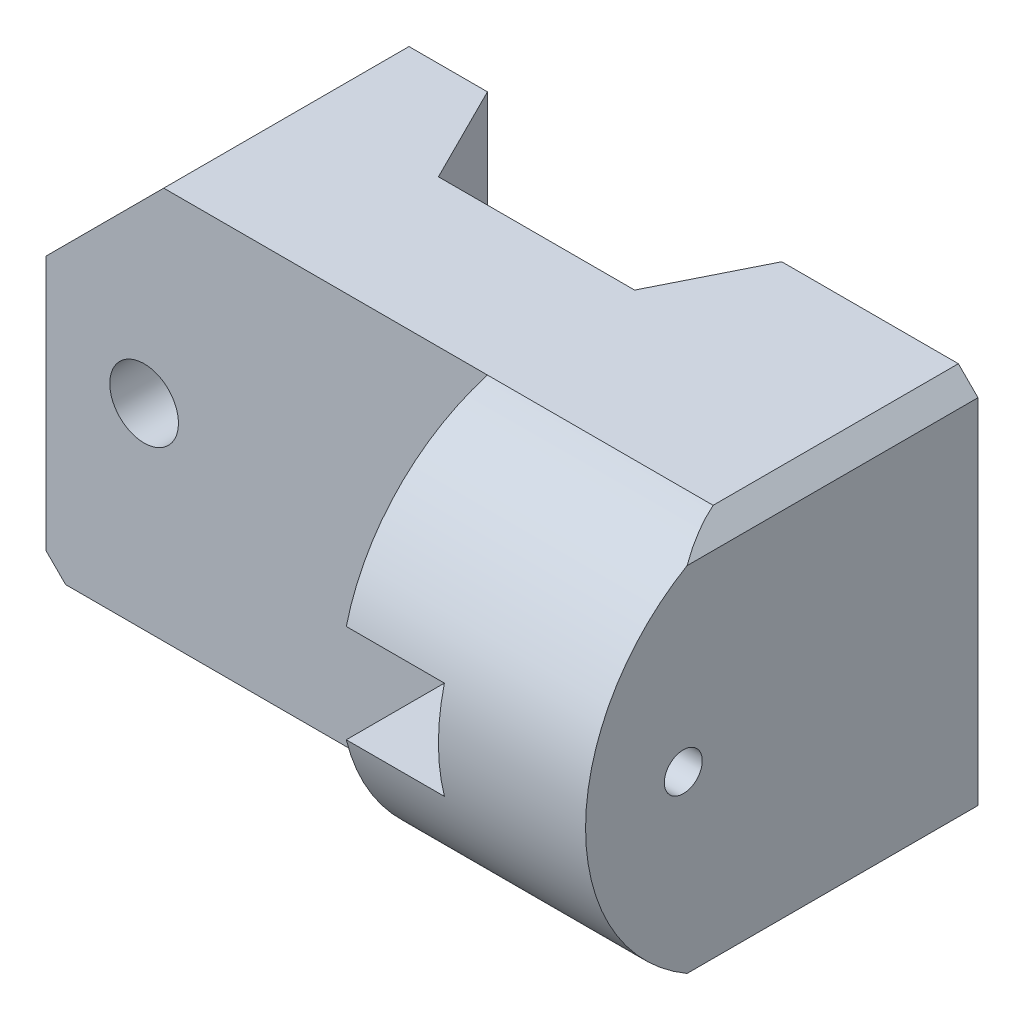
ISO-10303-21;
HEADER;
FILE_DESCRIPTION(('STEP AP214'),'2;1');
FILE_NAME('part.step','',(''),(''),'','','');
FILE_SCHEMA(('AUTOMOTIVE_DESIGN { 1 0 10303 214 1 1 1 1 }'));
ENDSEC;
DATA;
#1=APPLICATION_CONTEXT('core data for automotive mechanical design processes');
#2=APPLICATION_PROTOCOL_DEFINITION('international standard','automotive_design',2000,#1);
#3=PRODUCT_CONTEXT('',#1,'mechanical');
#4=PRODUCT('Part','Part','',(#3));
#5=PRODUCT_RELATED_PRODUCT_CATEGORY('part','',(#4));
#6=PRODUCT_DEFINITION_FORMATION('','',#4);
#7=PRODUCT_DEFINITION_CONTEXT('part definition',#1,'design');
#8=PRODUCT_DEFINITION('design','',#6,#7);
#9=PRODUCT_DEFINITION_SHAPE('','',#8);
#10=(LENGTH_UNIT() NAMED_UNIT(*) SI_UNIT(.MILLI.,.METRE.));
#11=(NAMED_UNIT(*) PLANE_ANGLE_UNIT() SI_UNIT($,.RADIAN.));
#12=(NAMED_UNIT(*) SI_UNIT($,.STERADIAN.) SOLID_ANGLE_UNIT());
#13=UNCERTAINTY_MEASURE_WITH_UNIT(LENGTH_MEASURE(1.E-05),#10,'distance_accuracy_value','');
#14=(GEOMETRIC_REPRESENTATION_CONTEXT(3) GLOBAL_UNCERTAINTY_ASSIGNED_CONTEXT((#13)) GLOBAL_UNIT_ASSIGNED_CONTEXT((#10,
#11,#12)) REPRESENTATION_CONTEXT('',''));
#15=CARTESIAN_POINT('',(0.,0.,0.));
#16=DIRECTION('',(0.,0.,1.));
#17=DIRECTION('',(1.,0.,0.));
#18=AXIS2_PLACEMENT_3D('',#15,#16,#17);
#19=CARTESIAN_POINT('',(10.,0.,6.66666666666667));
#20=DIRECTION('',(1.,0.,0.));
#21=DIRECTION('',(0.,0.,-1.));
#22=AXIS2_PLACEMENT_3D('',#19,#20,#21);
#23=CYLINDRICAL_SURFACE('',#22,20.8333333333333);
#24=DIRECTION('',(1.,0.,0.));
#25=VECTOR('',#24,1.);
#26=CARTESIAN_POINT('',(10.,5.,26.8911018325193));
#27=LINE('',#26,#25);
#28=CARTESIAN_POINT('',(10.,5.,26.8911018325193));
#29=VERTEX_POINT('',#28);
#30=CARTESIAN_POINT('',(20.,5.,26.8911018325193));
#31=VERTEX_POINT('',#30);
#32=EDGE_CURVE('E188',#29,#31,#27,.T.);
#33=ORIENTED_EDGE('',*,*,#32,.T.);
#34=CARTESIAN_POINT('',(20.,0.,6.66666666666667));
#35=DIRECTION('',(-1.,0.,0.));
#36=DIRECTION('',(0.,-1.,0.));
#37=AXIS2_PLACEMENT_3D('',#34,#35,#36);
#38=CIRCLE('',#37,20.8333333333333);
#39=CARTESIAN_POINT('',(20.,-4.99999999999999,26.8911018325193));
#40=VERTEX_POINT('',#39);
#41=EDGE_CURVE('E11',#31,#40,#38,.F.);
#42=ORIENTED_EDGE('',*,*,#41,.T.);
#43=DIRECTION('',(1.,0.,0.));
#44=VECTOR('',#43,1.);
#45=CARTESIAN_POINT('',(10.,-5.,26.8911018325193));
#46=LINE('',#45,#44);
#47=CARTESIAN_POINT('',(10.,-5.,26.8911018325193));
#48=VERTEX_POINT('',#47);
#49=EDGE_CURVE('E165',#40,#48,#46,.F.);
#50=ORIENTED_EDGE('',*,*,#49,.T.);
#51=CARTESIAN_POINT('',(10.,0.,6.66666666666667));
#52=DIRECTION('',(1.,0.,0.));
#53=DIRECTION('',(0.,0.,-1.));
#54=AXIS2_PLACEMENT_3D('',#51,#52,#53);
#55=CIRCLE('',#54,20.8333333333333);
#56=CARTESIAN_POINT('',(10.,-20.,12.5));
#57=VERTEX_POINT('',#56);
#58=EDGE_CURVE('E195',#48,#57,#55,.T.);
#59=ORIENTED_EDGE('',*,*,#58,.T.);
#60=DIRECTION('',(1.,0.,0.));
#61=VECTOR('',#60,1.);
#62=CARTESIAN_POINT('',(10.,-20.,12.5));
#63=LINE('',#62,#61);
#64=CARTESIAN_POINT('',(33.,-20.,12.5));
#65=VERTEX_POINT('',#64);
#66=EDGE_CURVE('E198',#57,#65,#63,.T.);
#67=ORIENTED_EDGE('',*,*,#66,.T.);
#68=CARTESIAN_POINT('',(53.,0.,6.66666666666667));
#69=DIRECTION('',(-0.707106781186548,0.707106781186548,0.));
#70=DIRECTION('',(0.707106781186548,0.707106781186548,0.));
#71=AXIS2_PLACEMENT_3D('',#68,#69,#70);
#72=ELLIPSE('',#71,29.4627825494395,20.8333333333333);
#73=CARTESIAN_POINT('',(35.,-18.,17.1560793183731));
#74=VERTEX_POINT('',#73);
#75=EDGE_CURVE('E289',#74,#65,#72,.F.);
#76=ORIENTED_EDGE('',*,*,#75,.F.);
#77=CARTESIAN_POINT('',(35.,0.,6.66666666666667));
#78=DIRECTION('',(1.,0.,0.));
#79=DIRECTION('',(0.,0.,-1.));
#80=AXIS2_PLACEMENT_3D('',#77,#78,#79);
#81=CIRCLE('',#80,20.8333333333333);
#82=CARTESIAN_POINT('',(35.,18.,17.156079318373));
#83=VERTEX_POINT('',#82);
#84=EDGE_CURVE('E190',#83,#74,#81,.T.);
#85=ORIENTED_EDGE('',*,*,#84,.F.);
#86=CARTESIAN_POINT('',(53.,0.,6.66666666666667));
#87=DIRECTION('',(-0.707106781186547,-0.707106781186548,0.));
#88=DIRECTION('',(0.707106781186548,-0.707106781186547,0.));
#89=AXIS2_PLACEMENT_3D('',#86,#87,#88);
#90=ELLIPSE('',#89,29.4627825494395,20.8333333333333);
#91=CARTESIAN_POINT('',(33.,20.,12.5));
#92=VERTEX_POINT('',#91);
#93=EDGE_CURVE('E291',#92,#83,#90,.F.);
#94=ORIENTED_EDGE('',*,*,#93,.F.);
#95=DIRECTION('',(-1.,0.,0.));
#96=VECTOR('',#95,1.);
#97=CARTESIAN_POINT('',(33.,20.,12.5));
#98=LINE('',#97,#96);
#99=CARTESIAN_POINT('',(10.,20.,12.5));
#100=VERTEX_POINT('',#99);
#101=EDGE_CURVE('E236',#92,#100,#98,.T.);
#102=ORIENTED_EDGE('',*,*,#101,.T.);
#103=EDGE_CURVE('E191',#100,#29,#55,.T.);
#104=ORIENTED_EDGE('',*,*,#103,.T.);
#105=EDGE_LOOP('',(#33,#42,#50,#59,#67,#76,#85,#94,#102,#104));
#106=FACE_BOUND('',#105,.T.);
#107=ADVANCED_FACE('F39',(#106),#23,.T.);
#108=CARTESIAN_POINT('',(10.,0.,6.66666666666667));
#109=DIRECTION('',(1.,0.,0.));
#110=DIRECTION('',(0.,0.,-1.));
#111=AXIS2_PLACEMENT_3D('',#108,#109,#110);
#112=PLANE('',#111);
#113=DIRECTION('',(0.,0.,-1.));
#114=VECTOR('',#113,1.);
#115=CARTESIAN_POINT('',(10.,5.,6.66666666666667));
#116=LINE('',#115,#114);
#117=CARTESIAN_POINT('',(10.,5.,12.5));
#118=VERTEX_POINT('',#117);
#119=EDGE_CURVE('E47',#29,#118,#116,.T.);
#120=ORIENTED_EDGE('',*,*,#119,.F.);
#121=ORIENTED_EDGE('',*,*,#103,.F.);
#122=DIRECTION('',(0.,1.,0.));
#123=VECTOR('',#122,1.);
#124=CARTESIAN_POINT('',(10.,20.,12.5));
#125=LINE('',#124,#123);
#126=EDGE_CURVE('E194',#118,#100,#125,.T.);
#127=ORIENTED_EDGE('',*,*,#126,.F.);
#128=EDGE_LOOP('',(#120,#121,#127));
#129=FACE_BOUND('',#128,.T.);
#130=ADVANCED_FACE('F369',(#129),#112,.F.);
#131=DIRECTION('',(0.,0.,1.));
#132=VECTOR('',#131,1.);
#133=CARTESIAN_POINT('',(10.,-5.,6.66666666666667));
#134=LINE('',#133,#132);
#135=CARTESIAN_POINT('',(10.,-5.,12.5));
#136=VERTEX_POINT('',#135);
#137=EDGE_CURVE('E294',#136,#48,#134,.T.);
#138=ORIENTED_EDGE('',*,*,#137,.F.);
#139=EDGE_CURVE('E196',#57,#136,#125,.T.);
#140=ORIENTED_EDGE('',*,*,#139,.F.);
#141=ORIENTED_EDGE('',*,*,#58,.F.);
#142=EDGE_LOOP('',(#138,#140,#141));
#143=FACE_BOUND('',#142,.T.);
#144=ADVANCED_FACE('F303',(#143),#112,.F.);
#145=CARTESIAN_POINT('',(0.,0.,12.5));
#146=DIRECTION('',(0.,0.,1.));
#147=DIRECTION('',(1.,0.,0.));
#148=AXIS2_PLACEMENT_3D('',#145,#146,#147);
#149=PLANE('',#148);
#150=CARTESIAN_POINT('',(-25.,0.,12.5));
#151=DIRECTION('',(0.,0.,1.));
#152=DIRECTION('',(1.,0.,0.));
#153=AXIS2_PLACEMENT_3D('',#150,#151,#152);
#154=CIRCLE('',#153,3.5);
#155=CARTESIAN_POINT('',(-21.5,0.,12.5));
#156=VERTEX_POINT('',#155);
#157=EDGE_CURVE('E230',#156,#156,#154,.T.);
#158=ORIENTED_EDGE('',*,*,#157,.F.);
#159=EDGE_LOOP('',(#158));
#160=FACE_BOUND('',#159,.T.);
#161=DIRECTION('',(1.,0.,0.));
#162=VECTOR('',#161,1.);
#163=CARTESIAN_POINT('',(33.,-20.,12.5));
#164=LINE('',#163,#162);
#165=CARTESIAN_POINT('',(-33.,-20.,12.5));
#166=VERTEX_POINT('',#165);
#167=EDGE_CURVE('E246',#166,#57,#164,.T.);
#168=ORIENTED_EDGE('',*,*,#167,.T.);
#169=ORIENTED_EDGE('',*,*,#139,.T.);
#170=DIRECTION('',(1.,0.,0.));
#171=VECTOR('',#170,1.);
#172=CARTESIAN_POINT('',(10.,-5.,12.5));
#173=LINE('',#172,#171);
#174=CARTESIAN_POINT('',(20.,-4.99999999999999,12.5));
#175=VERTEX_POINT('',#174);
#176=EDGE_CURVE('E171',#136,#175,#173,.T.);
#177=ORIENTED_EDGE('',*,*,#176,.T.);
#178=DIRECTION('',(0.,1.,0.));
#179=VECTOR('',#178,1.);
#180=CARTESIAN_POINT('',(20.,5.,12.5));
#181=LINE('',#180,#179);
#182=CARTESIAN_POINT('',(20.,5.,12.5));
#183=VERTEX_POINT('',#182);
#184=EDGE_CURVE('E162',#175,#183,#181,.T.);
#185=ORIENTED_EDGE('',*,*,#184,.T.);
#186=DIRECTION('',(-1.,0.,0.));
#187=VECTOR('',#186,1.);
#188=CARTESIAN_POINT('',(10.,5.,12.5));
#189=LINE('',#188,#187);
#190=EDGE_CURVE('E54',#183,#118,#189,.T.);
#191=ORIENTED_EDGE('',*,*,#190,.T.);
#192=ORIENTED_EDGE('',*,*,#126,.T.);
#193=CARTESIAN_POINT('',(-23.,20.,12.5));
#194=VERTEX_POINT('',#193);
#195=EDGE_CURVE('E240',#100,#194,#98,.T.);
#196=ORIENTED_EDGE('',*,*,#195,.T.);
#197=DIRECTION('',(-0.707106781186547,-0.707106781186548,0.));
#198=VECTOR('',#197,1.);
#199=CARTESIAN_POINT('',(-23.,20.,12.5));
#200=LINE('',#199,#198);
#201=CARTESIAN_POINT('',(-35.,8.,12.5));
#202=VERTEX_POINT('',#201);
#203=EDGE_CURVE('E239',#194,#202,#200,.T.);
#204=ORIENTED_EDGE('',*,*,#203,.T.);
#205=DIRECTION('',(0.,-1.,0.));
#206=VECTOR('',#205,1.);
#207=CARTESIAN_POINT('',(-35.,8.,12.5));
#208=LINE('',#207,#206);
#209=CARTESIAN_POINT('',(-35.,-18.,12.5));
#210=VERTEX_POINT('',#209);
#211=EDGE_CURVE('E242',#202,#210,#208,.T.);
#212=ORIENTED_EDGE('',*,*,#211,.T.);
#213=DIRECTION('',(0.707106781186548,-0.707106781186547,0.));
#214=VECTOR('',#213,1.);
#215=CARTESIAN_POINT('',(-33.,-20.,12.5));
#216=LINE('',#215,#214);
#217=EDGE_CURVE('E244',#210,#166,#216,.T.);
#218=ORIENTED_EDGE('',*,*,#217,.T.);
#219=EDGE_LOOP('',(#168,#169,#177,#185,#191,#192,#196,#204,#212,#218));
#220=FACE_BOUND('',#219,.T.);
#221=ADVANCED_FACE('F175',(#160,#220),#149,.T.);
#222=CARTESIAN_POINT('',(0.,0.,-12.5));
#223=DIRECTION('',(0.,0.,1.));
#224=DIRECTION('',(1.,0.,0.));
#225=AXIS2_PLACEMENT_3D('',#222,#223,#224);
#226=PLANE('',#225);
#227=CARTESIAN_POINT('',(-25.,0.,-12.5));
#228=DIRECTION('',(0.,0.,1.));
#229=DIRECTION('',(1.,0.,0.));
#230=AXIS2_PLACEMENT_3D('',#227,#228,#229);
#231=CIRCLE('',#230,3.5);
#232=CARTESIAN_POINT('',(-21.5,0.,-12.5));
#233=VERTEX_POINT('',#232);
#234=EDGE_CURVE('E224',#233,#233,#231,.T.);
#235=ORIENTED_EDGE('',*,*,#234,.T.);
#236=EDGE_LOOP('',(#235));
#237=FACE_BOUND('',#236,.T.);
#238=DIRECTION('',(-1.,0.,0.));
#239=VECTOR('',#238,1.);
#240=CARTESIAN_POINT('',(33.,20.,-12.5));
#241=LINE('',#240,#239);
#242=CARTESIAN_POINT('',(-15.,20.,-12.5));
#243=VERTEX_POINT('',#242);
#244=CARTESIAN_POINT('',(-23.,20.,-12.5));
#245=VERTEX_POINT('',#244);
#246=EDGE_CURVE('E233',#243,#245,#241,.T.);
#247=ORIENTED_EDGE('',*,*,#246,.F.);
#248=DIRECTION('',(0.,-1.,0.));
#249=VECTOR('',#248,1.);
#250=CARTESIAN_POINT('',(-15.,20.,-12.5));
#251=LINE('',#250,#249);
#252=CARTESIAN_POINT('',(-15.,-20.,-12.5));
#253=VERTEX_POINT('',#252);
#254=EDGE_CURVE('E221',#243,#253,#251,.T.);
#255=ORIENTED_EDGE('',*,*,#254,.T.);
#256=DIRECTION('',(1.,0.,0.));
#257=VECTOR('',#256,1.);
#258=CARTESIAN_POINT('',(33.,-20.,-12.5));
#259=LINE('',#258,#257);
#260=CARTESIAN_POINT('',(-33.,-20.,-12.5));
#261=VERTEX_POINT('',#260);
#262=EDGE_CURVE('E259',#261,#253,#259,.T.);
#263=ORIENTED_EDGE('',*,*,#262,.F.);
#264=DIRECTION('',(0.707106781186548,-0.707106781186547,0.));
#265=VECTOR('',#264,1.);
#266=CARTESIAN_POINT('',(-33.,-20.,-12.5));
#267=LINE('',#266,#265);
#268=CARTESIAN_POINT('',(-35.,-18.,-12.5));
#269=VERTEX_POINT('',#268);
#270=EDGE_CURVE('E256',#269,#261,#267,.T.);
#271=ORIENTED_EDGE('',*,*,#270,.F.);
#272=DIRECTION('',(0.,-1.,0.));
#273=VECTOR('',#272,1.);
#274=CARTESIAN_POINT('',(-35.,8.,-12.5));
#275=LINE('',#274,#273);
#276=CARTESIAN_POINT('',(-35.,8.,-12.5));
#277=VERTEX_POINT('',#276);
#278=EDGE_CURVE('E254',#277,#269,#275,.T.);
#279=ORIENTED_EDGE('',*,*,#278,.F.);
#280=DIRECTION('',(-0.707106781186547,-0.707106781186548,0.));
#281=VECTOR('',#280,1.);
#282=CARTESIAN_POINT('',(-23.,20.,-12.5));
#283=LINE('',#282,#281);
#284=EDGE_CURVE('E252',#245,#277,#283,.T.);
#285=ORIENTED_EDGE('',*,*,#284,.F.);
#286=EDGE_LOOP('',(#247,#255,#263,#271,#279,#285));
#287=FACE_BOUND('',#286,.T.);
#288=ADVANCED_FACE('F340',(#237,#287),#226,.F.);
#289=CARTESIAN_POINT('',(15.,-20.,-12.5));
#290=VERTEX_POINT('',#289);
#291=CARTESIAN_POINT('',(33.,-20.,-12.5));
#292=VERTEX_POINT('',#291);
#293=EDGE_CURVE('E258',#290,#292,#259,.T.);
#294=ORIENTED_EDGE('',*,*,#293,.F.);
#295=DIRECTION('',(0.,-1.,0.));
#296=VECTOR('',#295,1.);
#297=CARTESIAN_POINT('',(15.,20.,-12.5));
#298=LINE('',#297,#296);
#299=CARTESIAN_POINT('',(15.,20.,-12.5));
#300=VERTEX_POINT('',#299);
#301=EDGE_CURVE('E214',#300,#290,#298,.T.);
#302=ORIENTED_EDGE('',*,*,#301,.F.);
#303=CARTESIAN_POINT('',(33.,20.,-12.5));
#304=VERTEX_POINT('',#303);
#305=EDGE_CURVE('E249',#304,#300,#241,.T.);
#306=ORIENTED_EDGE('',*,*,#305,.F.);
#307=DIRECTION('',(-0.707106781186548,0.707106781186547,0.));
#308=VECTOR('',#307,1.);
#309=CARTESIAN_POINT('',(35.,18.,-12.5));
#310=LINE('',#309,#308);
#311=CARTESIAN_POINT('',(35.,18.,-12.5));
#312=VERTEX_POINT('',#311);
#313=EDGE_CURVE('E266',#312,#304,#310,.T.);
#314=ORIENTED_EDGE('',*,*,#313,.F.);
#315=DIRECTION('',(0.,1.,0.));
#316=VECTOR('',#315,1.);
#317=CARTESIAN_POINT('',(35.,18.,-12.5));
#318=LINE('',#317,#316);
#319=CARTESIAN_POINT('',(35.,-18.,-12.5));
#320=VERTEX_POINT('',#319);
#321=EDGE_CURVE('E264',#320,#312,#318,.T.);
#322=ORIENTED_EDGE('',*,*,#321,.F.);
#323=DIRECTION('',(0.707106781186547,0.707106781186547,0.));
#324=VECTOR('',#323,1.);
#325=CARTESIAN_POINT('',(35.,-18.,-12.5));
#326=LINE('',#325,#324);
#327=EDGE_CURVE('E262',#292,#320,#326,.T.);
#328=ORIENTED_EDGE('',*,*,#327,.F.);
#329=EDGE_LOOP('',(#294,#302,#306,#314,#322,#328));
#330=FACE_BOUND('',#329,.T.);
#331=ADVANCED_FACE('F356',(#330),#226,.F.);
#332=CARTESIAN_POINT('',(33.,20.,12.5));
#333=DIRECTION('',(0.,-1.,0.));
#334=DIRECTION('',(1.,0.,0.));
#335=AXIS2_PLACEMENT_3D('',#332,#333,#334);
#336=PLANE('',#335);
#337=DIRECTION('',(-1.,0.,0.));
#338=VECTOR('',#337,1.);
#339=CARTESIAN_POINT('',(-10.,20.,-2.5));
#340=LINE('',#339,#338);
#341=CARTESIAN_POINT('',(10.,20.,-2.5));
#342=VERTEX_POINT('',#341);
#343=CARTESIAN_POINT('',(-10.,20.,-2.5));
#344=VERTEX_POINT('',#343);
#345=EDGE_CURVE('E207',#342,#344,#340,.T.);
#346=ORIENTED_EDGE('',*,*,#345,.T.);
#347=DIRECTION('',(-0.447213595499958,0.,-0.894427190999916));
#348=VECTOR('',#347,1.);
#349=CARTESIAN_POINT('',(-10.,20.,-2.5));
#350=LINE('',#349,#348);
#351=EDGE_CURVE('E211',#344,#243,#350,.T.);
#352=ORIENTED_EDGE('',*,*,#351,.T.);
#353=ORIENTED_EDGE('',*,*,#246,.T.);
#354=DIRECTION('',(0.,0.,-1.));
#355=VECTOR('',#354,1.);
#356=CARTESIAN_POINT('',(-23.,20.,12.5));
#357=LINE('',#356,#355);
#358=EDGE_CURVE('E286',#194,#245,#357,.T.);
#359=ORIENTED_EDGE('',*,*,#358,.F.);
#360=ORIENTED_EDGE('',*,*,#195,.F.);
#361=ORIENTED_EDGE('',*,*,#101,.F.);
#362=DIRECTION('',(0.,0.,-1.));
#363=VECTOR('',#362,1.);
#364=CARTESIAN_POINT('',(33.,20.,12.5));
#365=LINE('',#364,#363);
#366=EDGE_CURVE('E248',#92,#304,#365,.T.);
#367=ORIENTED_EDGE('',*,*,#366,.T.);
#368=ORIENTED_EDGE('',*,*,#305,.T.);
#369=DIRECTION('',(-0.447213595499958,0.,0.894427190999916));
#370=VECTOR('',#369,1.);
#371=CARTESIAN_POINT('',(10.,20.,-2.5));
#372=LINE('',#371,#370);
#373=EDGE_CURVE('E204',#300,#342,#372,.T.);
#374=ORIENTED_EDGE('',*,*,#373,.T.);
#375=EDGE_LOOP('',(#346,#352,#353,#359,#360,#361,#367,#368,#374));
#376=FACE_BOUND('',#375,.T.);
#377=ADVANCED_FACE('F41',(#376),#336,.F.);
#378=CARTESIAN_POINT('',(-23.,20.,12.5));
#379=DIRECTION('',(0.707106781186548,-0.707106781186547,0.));
#380=DIRECTION('',(0.707106781186547,0.707106781186548,0.));
#381=AXIS2_PLACEMENT_3D('',#378,#379,#380);
#382=PLANE('',#381);
#383=ORIENTED_EDGE('',*,*,#284,.T.);
#384=DIRECTION('',(0.,0.,-1.));
#385=VECTOR('',#384,1.);
#386=CARTESIAN_POINT('',(-35.,8.,12.5));
#387=LINE('',#386,#385);
#388=EDGE_CURVE('E283',#202,#277,#387,.T.);
#389=ORIENTED_EDGE('',*,*,#388,.F.);
#390=ORIENTED_EDGE('',*,*,#203,.F.);
#391=ORIENTED_EDGE('',*,*,#358,.T.);
#392=EDGE_LOOP('',(#383,#389,#390,#391));
#393=FACE_BOUND('',#392,.T.);
#394=ADVANCED_FACE('F328',(#393),#382,.F.);
#395=CARTESIAN_POINT('',(-35.,8.,12.5));
#396=DIRECTION('',(1.,0.,0.));
#397=DIRECTION('',(0.,1.,0.));
#398=AXIS2_PLACEMENT_3D('',#395,#396,#397);
#399=PLANE('',#398);
#400=ORIENTED_EDGE('',*,*,#278,.T.);
#401=DIRECTION('',(0.,0.,-1.));
#402=VECTOR('',#401,1.);
#403=CARTESIAN_POINT('',(-35.,-18.,12.5));
#404=LINE('',#403,#402);
#405=EDGE_CURVE('E280',#210,#269,#404,.T.);
#406=ORIENTED_EDGE('',*,*,#405,.F.);
#407=ORIENTED_EDGE('',*,*,#211,.F.);
#408=ORIENTED_EDGE('',*,*,#388,.T.);
#409=EDGE_LOOP('',(#400,#406,#407,#408));
#410=FACE_BOUND('',#409,.T.);
#411=ADVANCED_FACE('F334',(#410),#399,.F.);
#412=CARTESIAN_POINT('',(-33.,-20.,12.5));
#413=DIRECTION('',(0.707106781186547,0.707106781186548,0.));
#414=DIRECTION('',(-0.707106781186548,0.707106781186547,0.));
#415=AXIS2_PLACEMENT_3D('',#412,#413,#414);
#416=PLANE('',#415);
#417=ORIENTED_EDGE('',*,*,#270,.T.);
#418=DIRECTION('',(0.,0.,-1.));
#419=VECTOR('',#418,1.);
#420=CARTESIAN_POINT('',(-33.,-20.,12.5));
#421=LINE('',#420,#419);
#422=EDGE_CURVE('E277',#166,#261,#421,.T.);
#423=ORIENTED_EDGE('',*,*,#422,.F.);
#424=ORIENTED_EDGE('',*,*,#217,.F.);
#425=ORIENTED_EDGE('',*,*,#405,.T.);
#426=EDGE_LOOP('',(#417,#423,#424,#425));
#427=FACE_BOUND('',#426,.T.);
#428=ADVANCED_FACE('F337',(#427),#416,.F.);
#429=CARTESIAN_POINT('',(33.,-20.,12.5));
#430=DIRECTION('',(0.,1.,0.));
#431=DIRECTION('',(-1.,0.,0.));
#432=AXIS2_PLACEMENT_3D('',#429,#430,#431);
#433=PLANE('',#432);
#434=ORIENTED_EDGE('',*,*,#262,.T.);
#435=DIRECTION('',(-0.447213595499958,0.,-0.894427190999916));
#436=VECTOR('',#435,1.);
#437=CARTESIAN_POINT('',(-10.,-20.,-2.5));
#438=LINE('',#437,#436);
#439=CARTESIAN_POINT('',(-10.,-20.,-2.5));
#440=VERTEX_POINT('',#439);
#441=EDGE_CURVE('E208',#440,#253,#438,.T.);
#442=ORIENTED_EDGE('',*,*,#441,.F.);
#443=DIRECTION('',(-1.,0.,0.));
#444=VECTOR('',#443,1.);
#445=CARTESIAN_POINT('',(-10.,-20.,-2.5));
#446=LINE('',#445,#444);
#447=CARTESIAN_POINT('',(10.,-20.,-2.5));
#448=VERTEX_POINT('',#447);
#449=EDGE_CURVE('E217',#448,#440,#446,.T.);
#450=ORIENTED_EDGE('',*,*,#449,.F.);
#451=DIRECTION('',(-0.447213595499958,0.,0.894427190999916));
#452=VECTOR('',#451,1.);
#453=CARTESIAN_POINT('',(10.,-20.,-2.5));
#454=LINE('',#453,#452);
#455=EDGE_CURVE('E203',#290,#448,#454,.T.);
#456=ORIENTED_EDGE('',*,*,#455,.F.);
#457=ORIENTED_EDGE('',*,*,#293,.T.);
#458=DIRECTION('',(0.,0.,-1.));
#459=VECTOR('',#458,1.);
#460=CARTESIAN_POINT('',(33.,-20.,12.5));
#461=LINE('',#460,#459);
#462=EDGE_CURVE('E274',#65,#292,#461,.T.);
#463=ORIENTED_EDGE('',*,*,#462,.F.);
#464=ORIENTED_EDGE('',*,*,#66,.F.);
#465=ORIENTED_EDGE('',*,*,#167,.F.);
#466=ORIENTED_EDGE('',*,*,#422,.T.);
#467=EDGE_LOOP('',(#434,#442,#450,#456,#457,#463,#464,#465,#466));
#468=FACE_BOUND('',#467,.T.);
#469=ADVANCED_FACE('F308',(#468),#433,.F.);
#470=CARTESIAN_POINT('',(35.,-18.,12.5));
#471=DIRECTION('',(-0.707106781186547,0.707106781186547,0.));
#472=DIRECTION('',(-0.707106781186548,-0.707106781186548,0.));
#473=AXIS2_PLACEMENT_3D('',#470,#471,#472);
#474=PLANE('',#473);
#475=ORIENTED_EDGE('',*,*,#327,.T.);
#476=DIRECTION('',(0.,0.,-1.));
#477=VECTOR('',#476,1.);
#478=CARTESIAN_POINT('',(35.,-18.,12.5));
#479=LINE('',#478,#477);
#480=EDGE_CURVE('E62',#74,#320,#479,.T.);
#481=ORIENTED_EDGE('',*,*,#480,.F.);
#482=ORIENTED_EDGE('',*,*,#75,.T.);
#483=ORIENTED_EDGE('',*,*,#462,.T.);
#484=EDGE_LOOP('',(#475,#481,#482,#483));
#485=FACE_BOUND('',#484,.T.);
#486=ADVANCED_FACE('F357',(#485),#474,.F.);
#487=CARTESIAN_POINT('',(35.,18.,12.5));
#488=DIRECTION('',(-1.,0.,0.));
#489=DIRECTION('',(0.,0.,1.));
#490=AXIS2_PLACEMENT_3D('',#487,#488,#489);
#491=PLANE('',#490);
#492=CARTESIAN_POINT('',(35.,0.,17.540032758984));
#493=DIRECTION('',(-1.,0.,0.));
#494=DIRECTION('',(0.,0.,1.));
#495=AXIS2_PLACEMENT_3D('',#492,#493,#494);
#496=CIRCLE('',#495,1.9347930310097);
#497=CARTESIAN_POINT('',(35.,0.,19.4748257899937));
#498=VERTEX_POINT('',#497);
#499=EDGE_CURVE('E177',#498,#498,#496,.T.);
#500=ORIENTED_EDGE('',*,*,#499,.T.);
#501=EDGE_LOOP('',(#500));
#502=FACE_BOUND('',#501,.T.);
#503=DIRECTION('',(0.,0.,-1.));
#504=VECTOR('',#503,1.);
#505=CARTESIAN_POINT('',(35.,18.,12.5));
#506=LINE('',#505,#504);
#507=EDGE_CURVE('E270',#83,#312,#506,.T.);
#508=ORIENTED_EDGE('',*,*,#507,.F.);
#509=ORIENTED_EDGE('',*,*,#84,.T.);
#510=ORIENTED_EDGE('',*,*,#480,.T.);
#511=ORIENTED_EDGE('',*,*,#321,.T.);
#512=EDGE_LOOP('',(#508,#509,#510,#511));
#513=FACE_BOUND('',#512,.T.);
#514=ADVANCED_FACE('F313',(#502,#513),#491,.F.);
#515=CARTESIAN_POINT('',(35.,18.,12.5));
#516=DIRECTION('',(-0.707106781186547,-0.707106781186548,0.));
#517=DIRECTION('',(0.707106781186548,-0.707106781186547,0.));
#518=AXIS2_PLACEMENT_3D('',#515,#516,#517);
#519=PLANE('',#518);
#520=ORIENTED_EDGE('',*,*,#313,.T.);
#521=ORIENTED_EDGE('',*,*,#366,.F.);
#522=ORIENTED_EDGE('',*,*,#93,.T.);
#523=ORIENTED_EDGE('',*,*,#507,.T.);
#524=EDGE_LOOP('',(#520,#521,#522,#523));
#525=FACE_BOUND('',#524,.T.);
#526=ADVANCED_FACE('F318',(#525),#519,.F.);
#527=CARTESIAN_POINT('',(-25.,0.,12.5));
#528=DIRECTION('',(0.,0.,-1.));
#529=DIRECTION('',(-1.,0.,0.));
#530=AXIS2_PLACEMENT_3D('',#527,#528,#529);
#531=CYLINDRICAL_SURFACE('',#530,3.5);
#532=ORIENTED_EDGE('',*,*,#157,.T.);
#533=EDGE_LOOP('',(#532));
#534=FACE_BOUND('',#533,.T.);
#535=ORIENTED_EDGE('',*,*,#234,.F.);
#536=EDGE_LOOP('',(#535));
#537=FACE_BOUND('',#536,.T.);
#538=ADVANCED_FACE('F380',(#534,#537),#531,.F.);
#539=CARTESIAN_POINT('',(-10.,20.,-2.5));
#540=DIRECTION('',(-0.894427190999916,0.,0.447213595499958));
#541=DIRECTION('',(0.447213595499958,0.,0.894427190999916));
#542=AXIS2_PLACEMENT_3D('',#539,#540,#541);
#543=PLANE('',#542);
#544=ORIENTED_EDGE('',*,*,#441,.T.);
#545=ORIENTED_EDGE('',*,*,#254,.F.);
#546=ORIENTED_EDGE('',*,*,#351,.F.);
#547=DIRECTION('',(0.,-1.,0.));
#548=VECTOR('',#547,1.);
#549=CARTESIAN_POINT('',(-10.,20.,-2.5));
#550=LINE('',#549,#548);
#551=EDGE_CURVE('E225',#344,#440,#550,.T.);
#552=ORIENTED_EDGE('',*,*,#551,.T.);
#553=EDGE_LOOP('',(#544,#545,#546,#552));
#554=FACE_BOUND('',#553,.T.);
#555=ADVANCED_FACE('F345',(#554),#543,.F.);
#556=CARTESIAN_POINT('',(-10.,20.,-2.5));
#557=DIRECTION('',(0.,0.,1.));
#558=DIRECTION('',(1.,0.,0.));
#559=AXIS2_PLACEMENT_3D('',#556,#557,#558);
#560=PLANE('',#559);
#561=ORIENTED_EDGE('',*,*,#449,.T.);
#562=ORIENTED_EDGE('',*,*,#551,.F.);
#563=ORIENTED_EDGE('',*,*,#345,.F.);
#564=DIRECTION('',(0.,-1.,0.));
#565=VECTOR('',#564,1.);
#566=CARTESIAN_POINT('',(10.,20.,-2.5));
#567=LINE('',#566,#565);
#568=EDGE_CURVE('E227',#342,#448,#567,.T.);
#569=ORIENTED_EDGE('',*,*,#568,.T.);
#570=EDGE_LOOP('',(#561,#562,#563,#569));
#571=FACE_BOUND('',#570,.T.);
#572=ADVANCED_FACE('F349',(#571),#560,.F.);
#573=CARTESIAN_POINT('',(10.,20.,-2.5));
#574=DIRECTION('',(0.894427190999916,0.,0.447213595499958));
#575=DIRECTION('',(0.447213595499958,0.,-0.894427190999916));
#576=AXIS2_PLACEMENT_3D('',#573,#574,#575);
#577=PLANE('',#576);
#578=ORIENTED_EDGE('',*,*,#455,.T.);
#579=ORIENTED_EDGE('',*,*,#568,.F.);
#580=ORIENTED_EDGE('',*,*,#373,.F.);
#581=ORIENTED_EDGE('',*,*,#301,.T.);
#582=EDGE_LOOP('',(#578,#579,#580,#581));
#583=FACE_BOUND('',#582,.T.);
#584=ADVANCED_FACE('F351',(#583),#577,.F.);
#585=CARTESIAN_POINT('',(20.,5.,27.5));
#586=DIRECTION('',(-1.,0.,0.));
#587=DIRECTION('',(0.,-1.,0.));
#588=AXIS2_PLACEMENT_3D('',#585,#586,#587);
#589=PLANE('',#588);
#590=CARTESIAN_POINT('',(20.,0.,17.540032758984));
#591=DIRECTION('',(-1.,0.,0.));
#592=DIRECTION('',(0.,0.,1.));
#593=AXIS2_PLACEMENT_3D('',#590,#591,#592);
#594=CIRCLE('',#593,1.9347930310097);
#595=CARTESIAN_POINT('',(20.,0.,19.4748257899937));
#596=VERTEX_POINT('',#595);
#597=EDGE_CURVE('E180',#596,#596,#594,.T.);
#598=ORIENTED_EDGE('',*,*,#597,.F.);
#599=EDGE_LOOP('',(#598));
#600=FACE_BOUND('',#599,.T.);
#601=DIRECTION('',(0.,0.,-1.));
#602=VECTOR('',#601,1.);
#603=CARTESIAN_POINT('',(20.,5.,27.5));
#604=LINE('',#603,#602);
#605=EDGE_CURVE('E159',#31,#183,#604,.T.);
#606=ORIENTED_EDGE('',*,*,#605,.T.);
#607=ORIENTED_EDGE('',*,*,#184,.F.);
#608=DIRECTION('',(0.,0.,-1.));
#609=VECTOR('',#608,1.);
#610=CARTESIAN_POINT('',(20.,-4.99999999999999,27.5));
#611=LINE('',#610,#609);
#612=EDGE_CURVE('E166',#40,#175,#611,.T.);
#613=ORIENTED_EDGE('',*,*,#612,.F.);
#614=ORIENTED_EDGE('',*,*,#41,.F.);
#615=EDGE_LOOP('',(#606,#607,#613,#614));
#616=FACE_BOUND('',#615,.T.);
#617=ADVANCED_FACE('F160',(#600,#616),#589,.T.);
#618=CARTESIAN_POINT('',(10.,5.,27.5));
#619=DIRECTION('',(0.,-1.,0.));
#620=DIRECTION('',(1.,0.,0.));
#621=AXIS2_PLACEMENT_3D('',#618,#619,#620);
#622=PLANE('',#621);
#623=ORIENTED_EDGE('',*,*,#119,.T.);
#624=ORIENTED_EDGE('',*,*,#190,.F.);
#625=ORIENTED_EDGE('',*,*,#605,.F.);
#626=ORIENTED_EDGE('',*,*,#32,.F.);
#627=EDGE_LOOP('',(#623,#624,#625,#626));
#628=FACE_BOUND('',#627,.T.);
#629=ADVANCED_FACE('F168',(#628),#622,.T.);
#630=CARTESIAN_POINT('',(10.,-5.,27.5));
#631=DIRECTION('',(0.,1.,0.));
#632=DIRECTION('',(-1.,0.,0.));
#633=AXIS2_PLACEMENT_3D('',#630,#631,#632);
#634=PLANE('',#633);
#635=ORIENTED_EDGE('',*,*,#612,.T.);
#636=ORIENTED_EDGE('',*,*,#176,.F.);
#637=ORIENTED_EDGE('',*,*,#137,.T.);
#638=ORIENTED_EDGE('',*,*,#49,.F.);
#639=EDGE_LOOP('',(#635,#636,#637,#638));
#640=FACE_BOUND('',#639,.T.);
#641=ADVANCED_FACE('F297',(#640),#634,.T.);
#642=CARTESIAN_POINT('',(35.,0.,17.540032758984));
#643=DIRECTION('',(-1.,0.,0.));
#644=DIRECTION('',(0.,0.,1.));
#645=AXIS2_PLACEMENT_3D('',#642,#643,#644);
#646=CYLINDRICAL_SURFACE('',#645,1.9347930310097);
#647=ORIENTED_EDGE('',*,*,#499,.F.);
#648=EDGE_LOOP('',(#647));
#649=FACE_BOUND('',#648,.T.);
#650=ORIENTED_EDGE('',*,*,#597,.T.);
#651=EDGE_LOOP('',(#650));
#652=FACE_BOUND('',#651,.T.);
#653=ADVANCED_FACE('F453',(#649,#652),#646,.F.);
#654=CLOSED_SHELL('',(#107,#130,#144,#221,#288,#331,#377,#394,#411,#428,#469,#486,#514,#526,
#538,#555,#572,#584,#617,#629,#641,#653));
#655=MANIFOLD_SOLID_BREP('B2',#654);
#656=ADVANCED_BREP_SHAPE_REPRESENTATION('',(#18,#655),#14);
#657=SHAPE_DEFINITION_REPRESENTATION(#9,#656);
ENDSEC;
END-ISO-10303-21;
